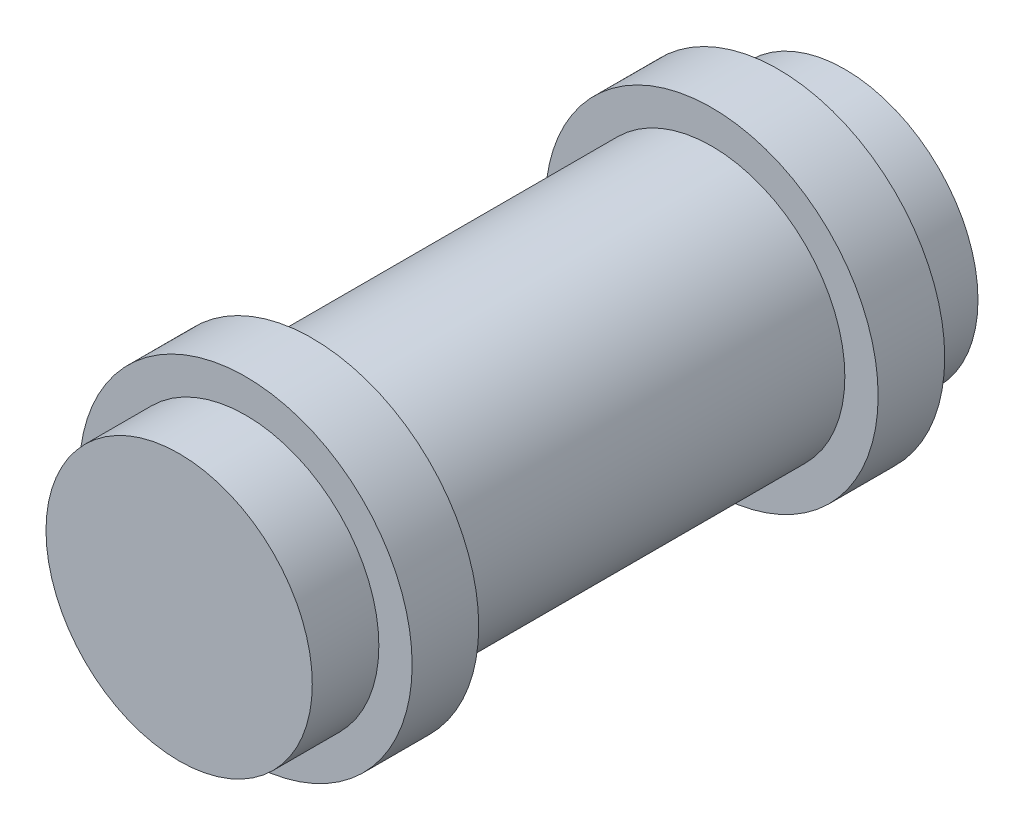
ISO-10303-21;
HEADER;
FILE_DESCRIPTION(('STEP AP214'),'2;1');
FILE_NAME('part.step','',(''),(''),'','','');
FILE_SCHEMA(('AUTOMOTIVE_DESIGN { 1 0 10303 214 1 1 1 1 }'));
ENDSEC;
DATA;
#1=APPLICATION_CONTEXT('core data for automotive mechanical design processes');
#2=APPLICATION_PROTOCOL_DEFINITION('international standard','automotive_design',2000,#1);
#3=PRODUCT_CONTEXT('',#1,'mechanical');
#4=PRODUCT('Part','Part','',(#3));
#5=PRODUCT_RELATED_PRODUCT_CATEGORY('part','',(#4));
#6=PRODUCT_DEFINITION_FORMATION('','',#4);
#7=PRODUCT_DEFINITION_CONTEXT('part definition',#1,'design');
#8=PRODUCT_DEFINITION('design','',#6,#7);
#9=PRODUCT_DEFINITION_SHAPE('','',#8);
#10=(LENGTH_UNIT() NAMED_UNIT(*) SI_UNIT(.MILLI.,.METRE.));
#11=(NAMED_UNIT(*) PLANE_ANGLE_UNIT() SI_UNIT($,.RADIAN.));
#12=(NAMED_UNIT(*) SI_UNIT($,.STERADIAN.) SOLID_ANGLE_UNIT());
#13=UNCERTAINTY_MEASURE_WITH_UNIT(LENGTH_MEASURE(1.E-05),#10,'distance_accuracy_value','');
#14=(GEOMETRIC_REPRESENTATION_CONTEXT(3) GLOBAL_UNCERTAINTY_ASSIGNED_CONTEXT((#13)) GLOBAL_UNIT_ASSIGNED_CONTEXT((#10,
#11,#12)) REPRESENTATION_CONTEXT('',''));
#15=CARTESIAN_POINT('',(0.,0.,0.));
#16=DIRECTION('',(0.,0.,1.));
#17=DIRECTION('',(1.,0.,0.));
#18=AXIS2_PLACEMENT_3D('',#15,#16,#17);
#19=CARTESIAN_POINT('',(0.,0.,50.));
#20=DIRECTION('',(0.,0.,-1.));
#21=DIRECTION('',(-1.,0.,0.));
#22=AXIS2_PLACEMENT_3D('',#19,#20,#21);
#23=CYLINDRICAL_SURFACE('',#22,10.);
#24=CARTESIAN_POINT('',(0.,0.,40.));
#25=DIRECTION('',(0.,0.,1.));
#26=DIRECTION('',(1.,0.,0.));
#27=AXIS2_PLACEMENT_3D('',#24,#25,#26);
#28=CIRCLE('',#27,10.);
#29=CARTESIAN_POINT('',(10.,0.,40.));
#30=VERTEX_POINT('',#29);
#31=EDGE_CURVE('E38',#30,#30,#28,.T.);
#32=ORIENTED_EDGE('',*,*,#31,.F.);
#33=EDGE_LOOP('',(#32));
#34=FACE_BOUND('',#33,.T.);
#35=CARTESIAN_POINT('',(0.,0.,10.));
#36=DIRECTION('',(0.,0.,-1.));
#37=DIRECTION('',(-1.,0.,0.));
#38=AXIS2_PLACEMENT_3D('',#35,#36,#37);
#39=CIRCLE('',#38,10.);
#40=CARTESIAN_POINT('',(-10.,0.,10.));
#41=VERTEX_POINT('',#40);
#42=EDGE_CURVE('E10',#41,#41,#39,.T.);
#43=ORIENTED_EDGE('',*,*,#42,.F.);
#44=EDGE_LOOP('',(#43));
#45=FACE_BOUND('',#44,.T.);
#46=ADVANCED_FACE('F31',(#34,#45),#23,.T.);
#47=CARTESIAN_POINT('',(0.,0.,40.));
#48=DIRECTION('',(0.,0.,1.));
#49=DIRECTION('',(1.,0.,0.));
#50=AXIS2_PLACEMENT_3D('',#47,#48,#49);
#51=CYLINDRICAL_SURFACE('',#50,12.5);
#52=CARTESIAN_POINT('',(0.,0.,40.));
#53=DIRECTION('',(0.,0.,1.));
#54=DIRECTION('',(1.,0.,0.));
#55=AXIS2_PLACEMENT_3D('',#52,#53,#54);
#56=CIRCLE('',#55,12.5);
#57=CARTESIAN_POINT('',(12.5,0.,40.));
#58=VERTEX_POINT('',#57);
#59=EDGE_CURVE('E59',#58,#58,#56,.T.);
#60=ORIENTED_EDGE('',*,*,#59,.T.);
#61=EDGE_LOOP('',(#60));
#62=FACE_BOUND('',#61,.T.);
#63=CARTESIAN_POINT('',(0.,0.,45.));
#64=DIRECTION('',(0.,0.,1.));
#65=DIRECTION('',(1.,0.,0.));
#66=AXIS2_PLACEMENT_3D('',#63,#64,#65);
#67=CIRCLE('',#66,12.5);
#68=CARTESIAN_POINT('',(12.5,0.,45.));
#69=VERTEX_POINT('',#68);
#70=EDGE_CURVE('E54',#69,#69,#67,.T.);
#71=ORIENTED_EDGE('',*,*,#70,.F.);
#72=EDGE_LOOP('',(#71));
#73=FACE_BOUND('',#72,.T.);
#74=ADVANCED_FACE('F86',(#62,#73),#51,.T.);
#75=CARTESIAN_POINT('',(0.,0.,40.));
#76=DIRECTION('',(0.,0.,1.));
#77=DIRECTION('',(1.,0.,0.));
#78=AXIS2_PLACEMENT_3D('',#75,#76,#77);
#79=PLANE('',#78);
#80=ORIENTED_EDGE('',*,*,#31,.T.);
#81=EDGE_LOOP('',(#80));
#82=FACE_BOUND('',#81,.T.);
#83=ORIENTED_EDGE('',*,*,#59,.F.);
#84=EDGE_LOOP('',(#83));
#85=FACE_BOUND('',#84,.T.);
#86=ADVANCED_FACE('F82',(#82,#85),#79,.F.);
#87=CARTESIAN_POINT('',(0.,0.,45.));
#88=DIRECTION('',(0.,0.,1.));
#89=DIRECTION('',(1.,0.,0.));
#90=AXIS2_PLACEMENT_3D('',#87,#88,#89);
#91=PLANE('',#90);
#92=CARTESIAN_POINT('',(0.,0.,45.));
#93=DIRECTION('',(0.,0.,1.));
#94=DIRECTION('',(1.,0.,0.));
#95=AXIS2_PLACEMENT_3D('',#92,#93,#94);
#96=CIRCLE('',#95,10.);
#97=CARTESIAN_POINT('',(10.,0.,45.));
#98=VERTEX_POINT('',#97);
#99=EDGE_CURVE('E50',#98,#98,#96,.T.);
#100=ORIENTED_EDGE('',*,*,#99,.F.);
#101=EDGE_LOOP('',(#100));
#102=FACE_BOUND('',#101,.T.);
#103=ORIENTED_EDGE('',*,*,#70,.T.);
#104=EDGE_LOOP('',(#103));
#105=FACE_BOUND('',#104,.T.);
#106=ADVANCED_FACE('F78',(#102,#105),#91,.T.);
#107=CARTESIAN_POINT('',(0.,0.,50.));
#108=DIRECTION('',(0.,0.,1.));
#109=DIRECTION('',(1.,0.,0.));
#110=AXIS2_PLACEMENT_3D('',#107,#108,#109);
#111=PLANE('',#110);
#112=CARTESIAN_POINT('',(0.,0.,50.));
#113=DIRECTION('',(0.,0.,1.));
#114=DIRECTION('',(1.,0.,0.));
#115=AXIS2_PLACEMENT_3D('',#112,#113,#114);
#116=CIRCLE('',#115,10.);
#117=CARTESIAN_POINT('',(10.,0.,50.));
#118=VERTEX_POINT('',#117);
#119=EDGE_CURVE('E42',#118,#118,#116,.T.);
#120=ORIENTED_EDGE('',*,*,#119,.T.);
#121=EDGE_LOOP('',(#120));
#122=FACE_BOUND('',#121,.T.);
#123=ADVANCED_FACE('F81',(#122),#111,.T.);
#124=ORIENTED_EDGE('',*,*,#99,.T.);
#125=EDGE_LOOP('',(#124));
#126=FACE_BOUND('',#125,.T.);
#127=ORIENTED_EDGE('',*,*,#119,.F.);
#128=EDGE_LOOP('',(#127));
#129=FACE_BOUND('',#128,.T.);
#130=ADVANCED_FACE('F33',(#126,#129),#23,.T.);
#131=CARTESIAN_POINT('',(0.,0.,10.));
#132=DIRECTION('',(0.,0.,-1.));
#133=DIRECTION('',(-1.,0.,0.));
#134=AXIS2_PLACEMENT_3D('',#131,#132,#133);
#135=CYLINDRICAL_SURFACE('',#134,12.5);
#136=CARTESIAN_POINT('',(0.,0.,10.));
#137=DIRECTION('',(0.,0.,1.));
#138=DIRECTION('',(1.,0.,0.));
#139=AXIS2_PLACEMENT_3D('',#136,#137,#138);
#140=CIRCLE('',#139,12.5);
#141=CARTESIAN_POINT('',(12.5,0.,10.));
#142=VERTEX_POINT('',#141);
#143=EDGE_CURVE('E55',#142,#142,#140,.T.);
#144=ORIENTED_EDGE('',*,*,#143,.F.);
#145=EDGE_LOOP('',(#144));
#146=FACE_BOUND('',#145,.T.);
#147=CARTESIAN_POINT('',(0.,0.,5.));
#148=DIRECTION('',(0.,0.,1.));
#149=DIRECTION('',(1.,0.,0.));
#150=AXIS2_PLACEMENT_3D('',#147,#148,#149);
#151=CIRCLE('',#150,12.5);
#152=CARTESIAN_POINT('',(12.5,0.,5.));
#153=VERTEX_POINT('',#152);
#154=EDGE_CURVE('E62',#153,#153,#151,.T.);
#155=ORIENTED_EDGE('',*,*,#154,.T.);
#156=EDGE_LOOP('',(#155));
#157=FACE_BOUND('',#156,.T.);
#158=ADVANCED_FACE('F114',(#146,#157),#135,.T.);
#159=CARTESIAN_POINT('',(0.,0.,10.));
#160=DIRECTION('',(0.,0.,-1.));
#161=DIRECTION('',(1.,0.,0.));
#162=AXIS2_PLACEMENT_3D('',#159,#160,#161);
#163=PLANE('',#162);
#164=ORIENTED_EDGE('',*,*,#42,.T.);
#165=EDGE_LOOP('',(#164));
#166=FACE_BOUND('',#165,.T.);
#167=ORIENTED_EDGE('',*,*,#143,.T.);
#168=EDGE_LOOP('',(#167));
#169=FACE_BOUND('',#168,.T.);
#170=ADVANCED_FACE('F108',(#166,#169),#163,.F.);
#171=CARTESIAN_POINT('',(0.,0.,5.));
#172=DIRECTION('',(0.,0.,-1.));
#173=DIRECTION('',(1.,0.,0.));
#174=AXIS2_PLACEMENT_3D('',#171,#172,#173);
#175=PLANE('',#174);
#176=CARTESIAN_POINT('',(0.,0.,5.));
#177=DIRECTION('',(0.,0.,-1.));
#178=DIRECTION('',(-1.,0.,0.));
#179=AXIS2_PLACEMENT_3D('',#176,#177,#178);
#180=CIRCLE('',#179,10.);
#181=CARTESIAN_POINT('',(-10.,0.,5.));
#182=VERTEX_POINT('',#181);
#183=EDGE_CURVE('E52',#182,#182,#180,.T.);
#184=ORIENTED_EDGE('',*,*,#183,.F.);
#185=EDGE_LOOP('',(#184));
#186=FACE_BOUND('',#185,.T.);
#187=ORIENTED_EDGE('',*,*,#154,.F.);
#188=EDGE_LOOP('',(#187));
#189=FACE_BOUND('',#188,.T.);
#190=ADVANCED_FACE('F102',(#186,#189),#175,.T.);
#191=CARTESIAN_POINT('',(0.,0.,0.));
#192=DIRECTION('',(0.,0.,1.));
#193=DIRECTION('',(1.,0.,0.));
#194=AXIS2_PLACEMENT_3D('',#191,#192,#193);
#195=PLANE('',#194);
#196=CARTESIAN_POINT('',(0.,0.,0.));
#197=DIRECTION('',(0.,0.,1.));
#198=DIRECTION('',(1.,0.,0.));
#199=AXIS2_PLACEMENT_3D('',#196,#197,#198);
#200=CIRCLE('',#199,10.);
#201=CARTESIAN_POINT('',(10.,0.,0.));
#202=VERTEX_POINT('',#201);
#203=EDGE_CURVE('E47',#202,#202,#200,.T.);
#204=ORIENTED_EDGE('',*,*,#203,.F.);
#205=EDGE_LOOP('',(#204));
#206=FACE_BOUND('',#205,.T.);
#207=ADVANCED_FACE('F100',(#206),#195,.F.);
#208=ORIENTED_EDGE('',*,*,#183,.T.);
#209=EDGE_LOOP('',(#208));
#210=FACE_BOUND('',#209,.T.);
#211=ORIENTED_EDGE('',*,*,#203,.T.);
#212=EDGE_LOOP('',(#211));
#213=FACE_BOUND('',#212,.T.);
#214=ADVANCED_FACE('F96',(#210,#213),#23,.T.);
#215=CLOSED_SHELL('',(#46,#74,#86,#106,#123,#130,#158,#170,#190,#207,#214));
#216=MANIFOLD_SOLID_BREP('B2',#215);
#217=ADVANCED_BREP_SHAPE_REPRESENTATION('',(#18,#216),#14);
#218=SHAPE_DEFINITION_REPRESENTATION(#9,#217);
ENDSEC;
END-ISO-10303-21;
